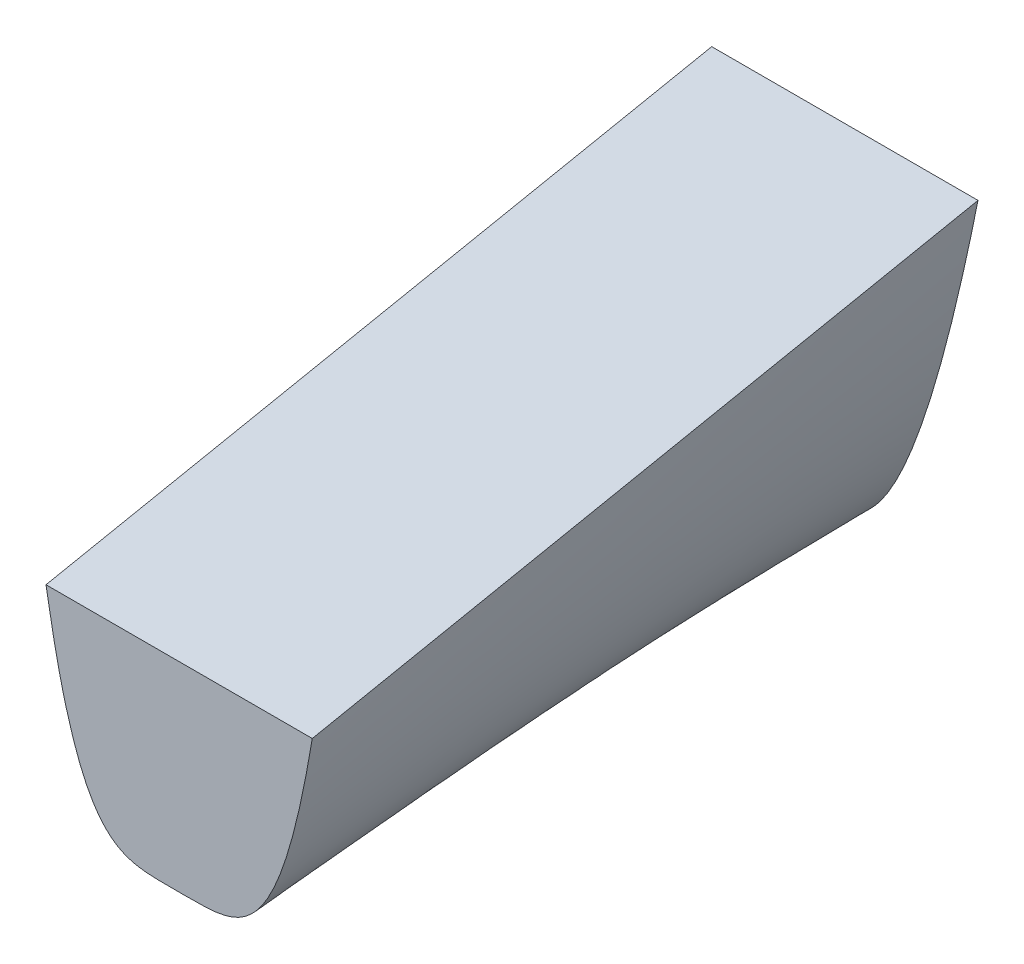
ISO-10303-21;
HEADER;
FILE_DESCRIPTION(('STEP AP214'),'2;1');
FILE_NAME('part.step','',(''),(''),'','','');
FILE_SCHEMA(('AUTOMOTIVE_DESIGN { 1 0 10303 214 1 1 1 1 }'));
ENDSEC;
DATA;
#1=APPLICATION_CONTEXT('core data for automotive mechanical design processes');
#2=APPLICATION_PROTOCOL_DEFINITION('international standard','automotive_design',2000,#1);
#3=PRODUCT_CONTEXT('',#1,'mechanical');
#4=PRODUCT('Part','Part','',(#3));
#5=PRODUCT_RELATED_PRODUCT_CATEGORY('part','',(#4));
#6=PRODUCT_DEFINITION_FORMATION('','',#4);
#7=PRODUCT_DEFINITION_CONTEXT('part definition',#1,'design');
#8=PRODUCT_DEFINITION('design','',#6,#7);
#9=PRODUCT_DEFINITION_SHAPE('','',#8);
#10=(LENGTH_UNIT() NAMED_UNIT(*) SI_UNIT(.MILLI.,.METRE.));
#11=(NAMED_UNIT(*) PLANE_ANGLE_UNIT() SI_UNIT($,.RADIAN.));
#12=(NAMED_UNIT(*) SI_UNIT($,.STERADIAN.) SOLID_ANGLE_UNIT());
#13=UNCERTAINTY_MEASURE_WITH_UNIT(LENGTH_MEASURE(1.E-05),#10,'distance_accuracy_value','');
#14=(GEOMETRIC_REPRESENTATION_CONTEXT(3) GLOBAL_UNCERTAINTY_ASSIGNED_CONTEXT((#13)) GLOBAL_UNIT_ASSIGNED_CONTEXT((#10,
#11,#12)) REPRESENTATION_CONTEXT('',''));
#15=CARTESIAN_POINT('',(0.,0.,0.));
#16=DIRECTION('',(0.,0.,1.));
#17=DIRECTION('',(1.,0.,0.));
#18=AXIS2_PLACEMENT_3D('',#15,#16,#17);
#19=CARTESIAN_POINT('',(-7.07314388390936E-06,-1.41546257599045E-05,100.));
#20=DIRECTION('',(0.,0.,-1.));
#21=DIRECTION('',(-1.,0.,0.));
#22=AXIS2_PLACEMENT_3D('',#19,#20,#21);
#23=PLANE('',#22);
#24=CARTESIAN_POINT('',(-19.9999999999994,29.9999999999965,100.));
#25=CARTESIAN_POINT('',(-19.9441923762206,29.6651542573238,100.));
#26=CARTESIAN_POINT('',(-19.857200851829,29.1512176439739,100.));
#27=CARTESIAN_POINT('',(-19.6765605062432,28.0948052006525,100.));
#28=CARTESIAN_POINT('',(-19.4897830422008,27.0512659515435,100.));
#29=CARTESIAN_POINT('',(-19.2581606568733,25.7764459296046,100.));
#30=CARTESIAN_POINT('',(-18.9251104210759,24.0267606190389,100.));
#31=CARTESIAN_POINT('',(-18.4367747497017,21.6090800937982,100.));
#32=CARTESIAN_POINT('',(-17.9143721107363,19.2527673280026,100.));
#33=CARTESIAN_POINT('',(-17.3315469400885,16.8753880800528,100.));
#34=CARTESIAN_POINT('',(-16.8031896980982,14.9229104971185,100.));
#35=CARTESIAN_POINT('',(-16.3471674765474,13.3611195962415,100.));
#36=CARTESIAN_POINT('',(-15.8021555370634,11.6520119155267,100.));
#37=CARTESIAN_POINT('',(-15.1418871066204,9.79628162884413,100.));
#38=CARTESIAN_POINT('',(-14.2715570723003,7.67785556494134,100.));
#39=CARTESIAN_POINT('',(-13.1903544662192,5.55240313965197,100.));
#40=CARTESIAN_POINT('',(-11.9586068813794,3.70838615414559,100.));
#41=CARTESIAN_POINT('',(-10.6104940277615,2.29559470085126,100.));
#42=CARTESIAN_POINT('',(-9.34306894038959,1.36886134230205,100.));
#43=CARTESIAN_POINT('',(-7.98565677478369,0.704914400081445,100.));
#44=CARTESIAN_POINT('',(-6.49935497524751,0.281460266086984,100.));
#45=CARTESIAN_POINT('',(-4.84430323818353,0.0703407528819955,100.));
#46=CARTESIAN_POINT('',(-2.77053001272273,-0.00757511720208186,100.));
#47=CARTESIAN_POINT('',(-0.378629984555512,0.00485774268614451,100.));
#48=CARTESIAN_POINT('',(2.19971723549633,-0.00768872637808428,100.));
#49=CARTESIAN_POINT('',(4.73891968921011,0.0289051899946942,100.));
#50=CARTESIAN_POINT('',(6.83085475042324,0.336331359287745,100.));
#51=CARTESIAN_POINT('',(8.42426079178498,0.889456257487804,100.));
#52=CARTESIAN_POINT('',(9.68957680013301,1.59380286159286,100.));
#53=CARTESIAN_POINT('',(10.9059378053144,2.57236774294863,100.));
#54=CARTESIAN_POINT('',(12.2187157199896,4.05520274822789,100.));
#55=CARTESIAN_POINT('',(13.4253948989038,5.96611938980997,100.));
#56=CARTESIAN_POINT('',(14.5036578418426,8.19232878751575,100.));
#57=CARTESIAN_POINT('',(15.3626857067344,10.3832949762724,100.));
#58=CARTESIAN_POINT('',(16.0086782688447,12.2763876152927,100.));
#59=CARTESIAN_POINT('',(16.6467593576929,14.3549937593641,100.));
#60=CARTESIAN_POINT('',(17.1651716985891,16.2334102448688,100.));
#61=CARTESIAN_POINT('',(17.6426772262796,18.1335739584919,100.));
#62=CARTESIAN_POINT('',(18.0822773286491,20.0258438105031,100.));
#63=CARTESIAN_POINT('',(18.4193820158746,21.5679723308811,100.));
#64=CARTESIAN_POINT('',(18.7322061970458,23.0671935776739,100.));
#65=CARTESIAN_POINT('',(19.0441814229877,24.65307305858,100.));
#66=CARTESIAN_POINT('',(19.282745504926,25.9064413448363,100.));
#67=CARTESIAN_POINT('',(19.5152501353264,27.1955001127824,100.));
#68=CARTESIAN_POINT('',(19.6811112423743,28.1194534072417,100.));
#69=CARTESIAN_POINT('',(19.8677405998705,29.2138611430391,100.));
#70=CARTESIAN_POINT('',(19.9463037473843,29.6778224843061,100.));
#71=CARTESIAN_POINT('',(20.0000000000002,30.0000000000011,100.));
#72=B_SPLINE_CURVE_WITH_KNOTS('',4,(#24,#25,#26,#27,#28,#29,#30,#31,#32,#33,#34,#35,#36,#37,#38,
#39,#40,#41,#42,#43,#44,#45,#46,#47,#48,#49,#50,#51,#52,#53,#54,#55,#56,#57,#58,#59,#60,#61,#62,
#63,#64,#65,#66,#67,#68,#69,#70,#71),.UNSPECIFIED.,.F.,.F.,(5,1,1,1,1,1,1,1,1,1,1,1,1,1,1,1,1,1,
1,1,1,1,1,1,1,1,1,1,1,1,1,1,1,1,1,1,1,1,1,1,1,1,1,1,5),(0.0817668190357321,0.0984305761639681,
0.106762454728086,0.115094333292204,0.13175809042044,0.148421847548676,0.181748719700463,
0.21507559185225,0.231739033132111,0.248402474411972,0.265065915691833,0.281729356971694,
0.30547286928285,0.329216381594006,0.359062796417253,0.379493590453079,0.396155704946258,
0.408982755364978,0.423211585978366,0.441248805076657,0.459286017640875,0.477323230205092,
0.508387330803966,0.53945143140284,0.565170975014561,0.581538278175593,0.594764997600991,
0.608342585754006,0.624375588523653,0.645335285371549,0.675731996142816,0.70078356020293,
0.725835124263045,0.741868132429536,0.757901140596026,0.789967156929007,0.806000346130956,
0.822033535332904,0.838066724534852,0.8540999137368,0.870133230543667,0.886166547350534,
0.894183205753967,0.902199864157401,0.918233180964268),.UNSPECIFIED.);
#73=CARTESIAN_POINT('',(-20.,30.,100.));
#74=VERTEX_POINT('',#73);
#75=CARTESIAN_POINT('',(20.,30.,100.));
#76=VERTEX_POINT('',#75);
#77=EDGE_CURVE('E60',#74,#76,#72,.T.);
#78=ORIENTED_EDGE('',*,*,#77,.T.);
#79=DIRECTION('',(-1.,0.,0.));
#80=VECTOR('',#79,1.);
#81=CARTESIAN_POINT('',(20.,30.,100.));
#82=LINE('',#81,#80);
#83=EDGE_CURVE('E12',#76,#74,#82,.T.);
#84=ORIENTED_EDGE('',*,*,#83,.T.);
#85=EDGE_LOOP('',(#78,#84));
#86=FACE_BOUND('',#85,.T.);
#87=ADVANCED_FACE('F50',(#86),#23,.F.);
#88=CARTESIAN_POINT('',(-4.40517493643541E-07,1.46190928649119E-05,0.));
#89=DIRECTION('',(0.,0.,-1.));
#90=DIRECTION('',(-1.,0.,0.));
#91=AXIS2_PLACEMENT_3D('',#88,#89,#90);
#92=PLANE('',#91);
#93=CARTESIAN_POINT('',(-20.0000000000472,50.0000000002362,0.));
#94=CARTESIAN_POINT('',(-19.9517790607697,49.7588953038544,0.));
#95=CARTESIAN_POINT('',(-19.8532644813701,49.2685405508555,0.));
#96=CARTESIAN_POINT('',(-19.627773198125,48.1511761129965,0.));
#97=CARTESIAN_POINT('',(-19.4287171732894,47.1833534879007,0.));
#98=CARTESIAN_POINT('',(-19.169650913097,45.9299676713935,0.));
#99=CARTESIAN_POINT('',(-18.9381889491059,44.8296318381181,0.));
#100=CARTESIAN_POINT('',(-18.6277704662497,43.3682099813327,0.));
#101=CARTESIAN_POINT('',(-18.132640683713,41.0807761547336,0.));
#102=CARTESIAN_POINT('',(-17.4255921608482,37.9140855088317,0.));
#103=CARTESIAN_POINT('',(-16.6206836501956,34.4841778673256,0.));
#104=CARTESIAN_POINT('',(-15.7699154289208,31.0548376782257,0.));
#105=CARTESIAN_POINT('',(-15.0278448996161,28.2106638356668,0.));
#106=CARTESIAN_POINT('',(-14.4109877085373,25.9388070113455,0.));
#107=CARTESIAN_POINT('',(-13.6084043521685,23.1098564612762,0.));
#108=CARTESIAN_POINT('',(-12.7576984536486,20.2934832752424,0.));
#109=CARTESIAN_POINT('',(-11.8487902038599,17.4963208763313,0.));
#110=CARTESIAN_POINT('',(-10.7492904292106,14.394731120889,0.));
#111=CARTESIAN_POINT('',(-9.64644944821577,11.550723931994,0.));
#112=CARTESIAN_POINT('',(-8.25437484339004,8.37453814177176,0.));
#113=CARTESIAN_POINT('',(-6.62465122561603,5.32396464290395,0.));
#114=CARTESIAN_POINT('',(-4.97602008608732,2.94017095176974,0.));
#115=CARTESIAN_POINT('',(-3.4057680389279,1.36456081010262,0.));
#116=CARTESIAN_POINT('',(-2.21850434858983,0.562512905718816,0.));
#117=CARTESIAN_POINT('',(-1.25192315653715,0.156781849959464,0.));
#118=CARTESIAN_POINT('',(-0.393784603638069,-0.0147285625745874,0.));
#119=CARTESIAN_POINT('',(0.431140159464196,-0.0106747486567985,0.));
#120=CARTESIAN_POINT('',(1.28963654179766,0.168803355211897,0.));
#121=CARTESIAN_POINT('',(2.25396652931771,0.582482824409479,0.));
#122=CARTESIAN_POINT('',(3.43670863418976,1.3916540757113,0.));
#123=CARTESIAN_POINT('',(4.99965056949894,2.97152475264672,0.));
#124=CARTESIAN_POINT('',(6.64878551065904,5.36342464333772,0.));
#125=CARTESIAN_POINT('',(8.28384864664726,8.43433140210539,0.));
#126=CARTESIAN_POINT('',(9.91446814910964,12.1668111790799,0.));
#127=CARTESIAN_POINT('',(11.4033044562052,16.1425220870475,0.));
#128=CARTESIAN_POINT('',(12.6181621915747,19.8279838406904,0.));
#129=CARTESIAN_POINT('',(13.6342296038593,23.1980849758727,0.));
#130=CARTESIAN_POINT('',(14.4323539930913,26.0158171156335,0.));
#131=CARTESIAN_POINT('',(15.0473449825512,28.2847471265564,0.));
#132=CARTESIAN_POINT('',(15.7844362656021,31.1112778820917,0.));
#133=CARTESIAN_POINT('',(16.635048967077,34.5460497262807,0.));
#134=CARTESIAN_POINT('',(17.4311271312386,37.9363210503983,0.));
#135=CARTESIAN_POINT('',(18.2077862798602,41.4203354008798,0.));
#136=CARTESIAN_POINT('',(18.7486359208628,43.9271021049214,0.));
#137=CARTESIAN_POINT('',(19.1362653023788,45.7729050516632,0.));
#138=CARTESIAN_POINT('',(19.444130890043,47.2497421762905,0.));
#139=CARTESIAN_POINT('',(19.7558862886169,48.7860425828812,0.));
#140=CARTESIAN_POINT('',(19.9038759269355,49.5193796344268,0.));
#141=CARTESIAN_POINT('',(20.0000000000473,50.0000000000002,0.));
#142=B_SPLINE_CURVE_WITH_KNOTS('',4,(#93,#94,#95,#96,#97,#98,#99,#100,#101,#102,#103,#104,#105,
#106,#107,#108,#109,#110,#111,#112,#113,#114,#115,#116,#117,#118,#119,#120,#121,#122,#123,#124,
#125,#126,#127,#128,#129,#130,#131,#132,#133,#134,#135,#136,#137,#138,#139,#140,#141),
.UNSPECIFIED.,.F.,.F.,(5,1,1,1,1,1,1,1,1,1,1,1,1,1,1,1,1,1,1,1,1,1,1,1,1,1,1,1,1,1,1,1,1,1,1,1,
1,1,1,1,1,1,1,1,1,5),(0.0820162515658378,0.0908584420863129,0.0997006326067879,
0.108542823127263,0.117385013647738,0.126227204168213,0.135069394688688,0.152753775729638,
0.188122420905431,0.223491066081224,0.241175439656181,0.258859813231138,0.276544186806096,
0.294228560381053,0.329597212598203,0.347281538706778,0.364965864815354,0.393133431047501,
0.421300997279649,0.451443776723832,0.468830295572381,0.479892057314251,0.487809028471789,
0.494256003577187,0.500150464148812,0.506025443641214,0.512446672614465,0.520450956510726,
0.531502578081296,0.548852368417361,0.578897618899332,0.60743213027905,0.635966641658767,
0.671218698193039,0.706470754727312,0.724096852249357,0.741722949771403,0.759349047293449,
0.776975144815495,0.812227235397409,0.847479325979324,0.865105431593033,0.882731537206743,
0.891544590013598,0.900357642820452,0.917983748434162),.UNSPECIFIED.);
#143=CARTESIAN_POINT('',(-20.,50.,0.));
#144=VERTEX_POINT('',#143);
#145=CARTESIAN_POINT('',(20.0000000000473,50.,0.));
#146=VERTEX_POINT('',#145);
#147=EDGE_CURVE('E84',#144,#146,#142,.T.);
#148=ORIENTED_EDGE('',*,*,#147,.F.);
#149=DIRECTION('',(-1.,0.,0.));
#150=VECTOR('',#149,1.);
#151=CARTESIAN_POINT('',(-20.,50.,0.));
#152=LINE('',#151,#150);
#153=EDGE_CURVE('E88',#146,#144,#152,.T.);
#154=ORIENTED_EDGE('',*,*,#153,.F.);
#155=EDGE_LOOP('',(#148,#154));
#156=FACE_BOUND('',#155,.T.);
#157=ADVANCED_FACE('F97',(#156),#92,.T.);
#158=CARTESIAN_POINT('',(-20.0000000000472,50.0000000002362,0.));
#159=CARTESIAN_POINT('',(-19.9999999999994,29.9999999999965,100.));
#160=CARTESIAN_POINT('',(-19.1629116801936,45.8145584010682,0.));
#161=CARTESIAN_POINT('',(-19.4859386631912,26.9156319791477,100.));
#162=CARTESIAN_POINT('',(-17.5373914789332,38.0941278265677,0.));
#163=CARTESIAN_POINT('',(-18.4352685741797,21.2321039093614,100.));
#164=CARTESIAN_POINT('',(-15.5703040449446,30.1683886376823,0.));
#165=CARTESIAN_POINT('',(-16.9950935053102,15.4206660520274,99.9999999999998));
#166=CARTESIAN_POINT('',(-13.9812119749786,24.3841606314388,0.));
#167=CARTESIAN_POINT('',(-15.6689090849217,11.2312297662041,99.9999999999999));
#168=CARTESIAN_POINT('',(-13.1008319042398,21.372189059836,0.));
#169=CARTESIAN_POINT('',(-14.88613472651,9.06668132714242,100.));
#170=CARTESIAN_POINT('',(-12.054306341649,18.1476520891632,0.));
#171=CARTESIAN_POINT('',(-13.8252333799464,6.81918106045193,100.));
#172=CARTESIAN_POINT('',(-11.3032608370138,15.9458903038131,0.));
#173=CARTESIAN_POINT('',(-13.0094218887027,5.32269431468691,100.));
#174=CARTESIAN_POINT('',(-10.7569282735189,14.4478181896573,0.));
#175=CARTESIAN_POINT('',(-12.3645394206608,4.34523650560651,99.9999999999999));
#176=CARTESIAN_POINT('',(-9.89050591591046,12.1982981221733,0.));
#177=CARTESIAN_POINT('',(-11.2635520250112,2.96117804666146,99.9999999999998));
#178=CARTESIAN_POINT('',(-9.27213694837578,10.6980689713508,0.));
#179=CARTESIAN_POINT('',(-10.4127407280998,2.11317693306054,99.9999999999997));
#180=CARTESIAN_POINT('',(-8.39344243364578,8.79545400162305,0.));
#181=CARTESIAN_POINT('',(-9.12243816153892,1.28254863610546,99.9999999999999));
#182=CARTESIAN_POINT('',(-7.65922570372883,7.28868849116063,0.));
#183=CARTESIAN_POINT('',(-8.02717542786111,0.72295509484153,100.));
#184=CARTESIAN_POINT('',(-6.95663532740775,6.01629532958077,0.));
#185=CARTESIAN_POINT('',(-6.99813215890086,0.428583703062479,100.));
#186=CARTESIAN_POINT('',(-6.0820074556812,4.59928832955645,0.));
#187=CARTESIAN_POINT('',(-5.79988031592384,0.201070227093185,100.));
#188=CARTESIAN_POINT('',(-5.3800661138175,3.55385390608402,0.));
#189=CARTESIAN_POINT('',(-4.88438536986906,0.092664010067847,100.));
#190=CARTESIAN_POINT('',(-4.13071748790258,2.068106464755,0.));
#191=CARTESIAN_POINT('',(-3.46417556176023,0.017520981492666,100.));
#192=CARTESIAN_POINT('',(-3.16511238689564,1.20096206617969,0.));
#193=CARTESIAN_POINT('',(-2.5204610906068,0.00643990128900953,100.));
#194=CARTESIAN_POINT('',(-2.04829090264779,0.494905510582458,0.));
#195=CARTESIAN_POINT('',(-1.55247192504504,0.000194170332262219,99.9999999999999));
#196=CARTESIAN_POINT('',(-0.929634972840186,-0.0124618273516826,0.));
#197=CARTESIAN_POINT('',(-0.664777567100886,-0.00198574525809788,99.9999999999999));
#198=CARTESIAN_POINT('',(0.42539835345027,-0.031224523591381,0.));
#199=CARTESIAN_POINT('',(0.302404294127587,-0.000887102841509851,100.));
#200=CARTESIAN_POINT('',(1.53004421260247,0.266569277721264,0.));
#201=CARTESIAN_POINT('',(1.1418821065925,-0.000336689929934123,100.));
#202=CARTESIAN_POINT('',(2.74022471600352,0.83572342193811,0.));
#203=CARTESIAN_POINT('',(2.11410429058195,-0.000575528580749061,100.));
#204=CARTESIAN_POINT('',(3.77966079763243,1.73806977874463,0.));
#205=CARTESIAN_POINT('',(3.11274401388217,0.00971045673143308,100.));
#206=CARTESIAN_POINT('',(4.78283762861716,2.83749810148346,0.));
#207=CARTESIAN_POINT('',(4.20211073944075,0.0543104116485641,100.));
#208=CARTESIAN_POINT('',(5.77181920725671,4.09842827670512,0.));
#209=CARTESIAN_POINT('',(5.37557948772715,0.132714813078881,100.));
#210=CARTESIAN_POINT('',(6.59230580084145,5.40276078145122,0.));
#211=CARTESIAN_POINT('',(6.49093802024388,0.3067835200494,100.));
#212=CARTESIAN_POINT('',(7.3274183943817,6.70515003520397,0.));
#213=CARTESIAN_POINT('',(7.54594233064034,0.598909719416461,100.));
#214=CARTESIAN_POINT('',(7.79298537106738,7.58027854749215,0.));
#215=CARTESIAN_POINT('',(8.23170792723966,0.841315045756129,100.));
#216=CARTESIAN_POINT('',(8.34728415635613,8.70132817973101,0.));
#217=CARTESIAN_POINT('',(9.05637200257821,1.24432752483375,100.));
#218=CARTESIAN_POINT('',(9.17560415810586,10.4787832554988,0.));
#219=CARTESIAN_POINT('',(10.2757526452522,2.00828066347136,99.9999999999998));
#220=CARTESIAN_POINT('',(9.9121863343706,12.2469583395424,0.));
#221=CARTESIAN_POINT('',(11.2941837708941,2.98964684405411,99.9999999999999));
#222=CARTESIAN_POINT('',(11.0026417134319,15.0828056944974,0.));
#223=CARTESIAN_POINT('',(12.6762588993456,4.73039241574092,100.));
#224=CARTESIAN_POINT('',(12.0665422243899,18.1143532218729,0.));
#225=CARTESIAN_POINT('',(13.8597996378708,6.78014202280923,100.));
#226=CARTESIAN_POINT('',(13.0448993669887,21.2417120401226,0.));
#227=CARTESIAN_POINT('',(14.8145293048473,8.98478256720129,100.));
#228=CARTESIAN_POINT('',(14.2906980778548,25.4448785131743,0.));
#229=CARTESIAN_POINT('',(15.9516898183705,11.9886579282526,100.));
#230=CARTESIAN_POINT('',(15.2571159688992,29.0290306641173,0.));
#231=CARTESIAN_POINT('',(16.7380902292336,14.5932346538194,99.9999999999999));
#232=CARTESIAN_POINT('',(17.4803760043709,37.8994724814323,0.));
#233=CARTESIAN_POINT('',(18.4084609199708,21.0838108468277,99.9999999999997));
#234=CARTESIAN_POINT('',(18.8540641908209,44.2703209536925,0.));
#235=CARTESIAN_POINT('',(19.2962733055285,25.7776398331707,100.));
#236=CARTESIAN_POINT('',(20.0000000000473,50.0000000000002,0.));
#237=CARTESIAN_POINT('',(20.0000000000002,30.0000000000011,100.));
#238=B_SPLINE_SURFACE_WITH_KNOTS('',3,1,((#158,#159),(#160,#161),(#162,#163),(#164,#165),(#166,
#167),(#168,#169),(#170,#171),(#172,#173),(#174,#175),(#176,#177),(#178,#179),(#180,#181),(#182,
#183),(#184,#185),(#186,#187),(#188,#189),(#190,#191),(#192,#193),(#194,#195),(#196,#197),(#198,
#199),(#200,#201),(#202,#203),(#204,#205),(#206,#207),(#208,#209),(#210,#211),(#212,#213),(#214,
#215),(#216,#217),(#218,#219),(#220,#221),(#222,#223),(#224,#225),(#226,#227),(#228,#229),(#230,
#231),(#232,#233),(#234,#235),(#236,#237)),.UNSPECIFIED.,.F.,.F.,.F.,(4,1,1,1,1,1,1,1,1,1,1,1,1,
1,1,1,1,1,1,1,1,1,1,1,1,1,1,1,1,1,1,1,1,1,1,1,1,4),(2,2),(0.,0.115122723684439,
0.212720245509695,0.220247256674184,0.276907396070822,0.297338817445459,0.311689040436336,
0.339652278250671,0.340344690883864,0.376706236058659,0.383400121581518,0.396859245120692,
0.421887643148269,0.422574525406022,0.44174199721907,0.455783443931113,0.474952722872594,
0.476473348882635,0.491415023119731,0.507633633978012,0.512090392579045,0.522334597783923,
0.543446738796612,0.548872383278099,0.562428370899641,0.586607730453777,0.590383056334919,
0.602749734073977,0.613337884741401,0.624111566239644,0.655649808788835,0.664986298109737,
0.706047875790538,0.742298269067736,0.753346423320526,0.824280934009687,0.842402285244519,1.),
(0.,1.),.UNSPECIFIED.);
#239=DIRECTION('',(-4.61865381120445E-13,-0.196116135138176,0.980580675690922));
#240=VECTOR('',#239,1.);
#241=CARTESIAN_POINT('',(20.0000000000237,40.0000000000006,50.));
#242=LINE('',#241,#240);
#243=EDGE_CURVE('E73',#146,#76,#242,.T.);
#244=DIRECTION('',(-4.68907671477618E-13,0.196116135140444,-0.980580675690468));
#245=VECTOR('',#244,1.);
#246=CARTESIAN_POINT('',(-20.0000000000233,40.0000000001164,50.));
#247=LINE('',#246,#245);
#248=EDGE_CURVE('E80',#74,#144,#247,.T.);
#249=ORIENTED_EDGE('',*,*,#147,.T.);
#250=ORIENTED_EDGE('',*,*,#243,.T.);
#251=ORIENTED_EDGE('',*,*,#77,.F.);
#252=ORIENTED_EDGE('',*,*,#248,.T.);
#253=EDGE_LOOP('',(#249,#250,#251,#252));
#254=FACE_BOUND('',#253,.T.);
#255=ADVANCED_FACE('F82',(#254),#238,.T.);
#256=CARTESIAN_POINT('',(0.,48.0769230769231,9.61538461538462));
#257=DIRECTION('',(0.,-0.98058067569092,-0.196116135138184));
#258=DIRECTION('',(0.,0.196116135138184,-0.98058067569092));
#259=AXIS2_PLACEMENT_3D('',#256,#257,#258);
#260=PLANE('',#259);
#261=ORIENTED_EDGE('',*,*,#248,.F.);
#262=ORIENTED_EDGE('',*,*,#83,.F.);
#263=ORIENTED_EDGE('',*,*,#243,.F.);
#264=ORIENTED_EDGE('',*,*,#153,.T.);
#265=EDGE_LOOP('',(#261,#262,#263,#264));
#266=FACE_BOUND('',#265,.T.);
#267=ADVANCED_FACE('F91',(#266),#260,.F.);
#268=CLOSED_SHELL('',(#87,#157,#255,#267));
#269=MANIFOLD_SOLID_BREP('B2',#268);
#270=ADVANCED_BREP_SHAPE_REPRESENTATION('',(#18,#269),#14);
#271=SHAPE_DEFINITION_REPRESENTATION(#9,#270);
ENDSEC;
END-ISO-10303-21;
